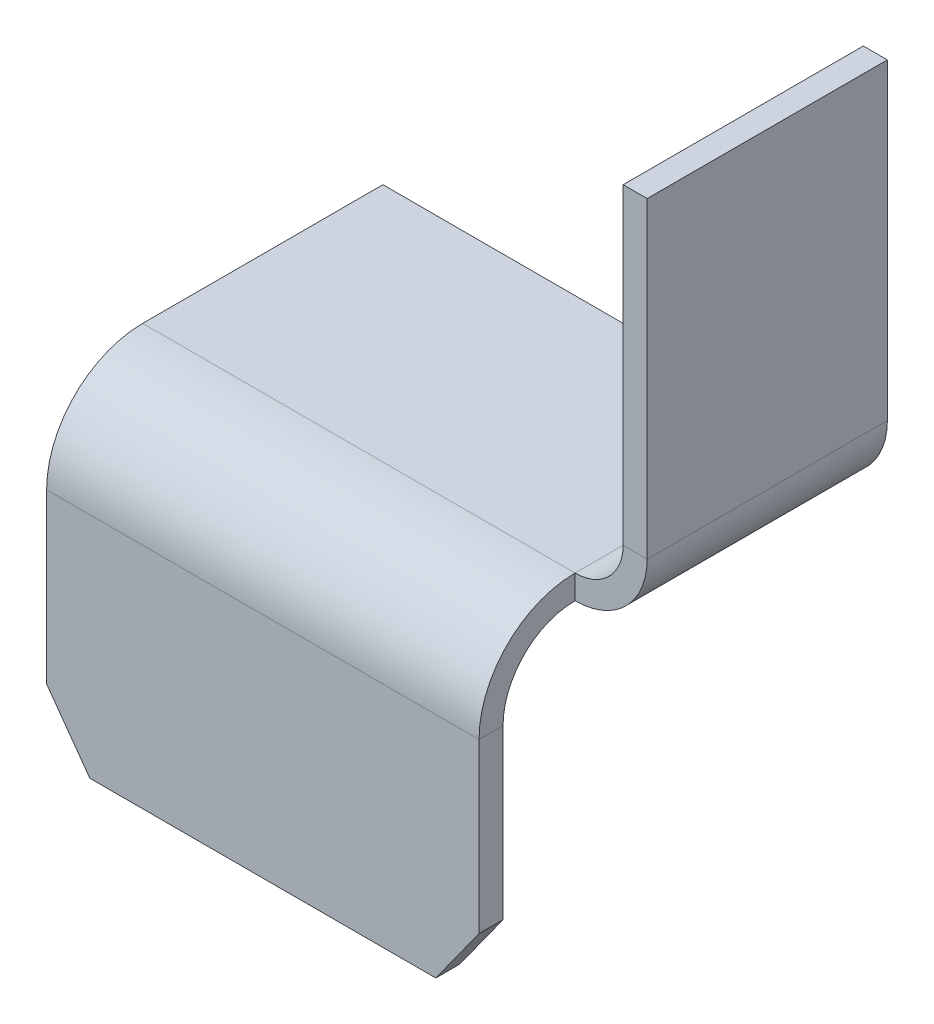
ISO-10303-21;
HEADER;
FILE_DESCRIPTION(('STEP AP214'),'2;1');
FILE_NAME('part.step','',(''),(''),'','','');
FILE_SCHEMA(('AUTOMOTIVE_DESIGN { 1 0 10303 214 1 1 1 1 }'));
ENDSEC;
DATA;
#1=APPLICATION_CONTEXT('core data for automotive mechanical design processes');
#2=APPLICATION_PROTOCOL_DEFINITION('international standard','automotive_design',2000,#1);
#3=PRODUCT_CONTEXT('',#1,'mechanical');
#4=PRODUCT('Part','Part','',(#3));
#5=PRODUCT_RELATED_PRODUCT_CATEGORY('part','',(#4));
#6=PRODUCT_DEFINITION_FORMATION('','',#4);
#7=PRODUCT_DEFINITION_CONTEXT('part definition',#1,'design');
#8=PRODUCT_DEFINITION('design','',#6,#7);
#9=PRODUCT_DEFINITION_SHAPE('','',#8);
#10=(LENGTH_UNIT() NAMED_UNIT(*) SI_UNIT(.MILLI.,.METRE.));
#11=(NAMED_UNIT(*) PLANE_ANGLE_UNIT() SI_UNIT($,.RADIAN.));
#12=(NAMED_UNIT(*) SI_UNIT($,.STERADIAN.) SOLID_ANGLE_UNIT());
#13=UNCERTAINTY_MEASURE_WITH_UNIT(LENGTH_MEASURE(1.E-05),#10,'distance_accuracy_value','');
#14=(GEOMETRIC_REPRESENTATION_CONTEXT(3) GLOBAL_UNCERTAINTY_ASSIGNED_CONTEXT((#13)) GLOBAL_UNIT_ASSIGNED_CONTEXT((#10,
#11,#12)) REPRESENTATION_CONTEXT('',''));
#15=CARTESIAN_POINT('',(0.,0.,0.));
#16=DIRECTION('',(0.,0.,1.));
#17=DIRECTION('',(1.,0.,0.));
#18=AXIS2_PLACEMENT_3D('',#15,#16,#17);
#19=CARTESIAN_POINT('',(20.,2.,10.));
#20=DIRECTION('',(0.,0.,1.));
#21=DIRECTION('',(1.,0.,0.));
#22=AXIS2_PLACEMENT_3D('',#19,#20,#21);
#23=PLANE('',#22);
#24=DIRECTION('',(1.,0.,0.));
#25=VECTOR('',#24,1.);
#26=CARTESIAN_POINT('',(20.,2.,10.));
#27=LINE('',#26,#25);
#28=CARTESIAN_POINT('',(20.,2.,10.));
#29=VERTEX_POINT('',#28);
#30=CARTESIAN_POINT('',(21.,2.,10.));
#31=VERTEX_POINT('',#30);
#32=EDGE_CURVE('E13',#29,#31,#27,.T.);
#33=ORIENTED_EDGE('',*,*,#32,.F.);
#34=CARTESIAN_POINT('',(18.,2.,10.));
#35=DIRECTION('',(0.,0.,-1.));
#36=DIRECTION('',(-1.,0.,0.));
#37=AXIS2_PLACEMENT_3D('',#34,#35,#36);
#38=CIRCLE('',#37,2.);
#39=CARTESIAN_POINT('',(18.,0.,10.));
#40=VERTEX_POINT('',#39);
#41=EDGE_CURVE('E138',#40,#29,#38,.F.);
#42=ORIENTED_EDGE('',*,*,#41,.F.);
#43=DIRECTION('',(0.,1.,0.));
#44=VECTOR('',#43,1.);
#45=CARTESIAN_POINT('',(18.,-1.,10.));
#46=LINE('',#45,#44);
#47=CARTESIAN_POINT('',(18.,-0.999999999999999,10.));
#48=VERTEX_POINT('',#47);
#49=EDGE_CURVE('E78',#48,#40,#46,.T.);
#50=ORIENTED_EDGE('',*,*,#49,.F.);
#51=CARTESIAN_POINT('',(18.,2.,10.));
#52=DIRECTION('',(0.,0.,1.));
#53=DIRECTION('',(1.,0.,0.));
#54=AXIS2_PLACEMENT_3D('',#51,#52,#53);
#55=CIRCLE('',#54,3.);
#56=EDGE_CURVE('E141',#48,#31,#55,.T.);
#57=ORIENTED_EDGE('',*,*,#56,.T.);
#58=EDGE_LOOP('',(#33,#42,#50,#57));
#59=FACE_BOUND('',#58,.T.);
#60=ADVANCED_FACE('F72',(#59),#23,.T.);
#61=CARTESIAN_POINT('',(18.,-1.,10.));
#62=DIRECTION('',(0.,0.,1.));
#63=DIRECTION('',(1.,0.,0.));
#64=AXIS2_PLACEMENT_3D('',#61,#62,#63);
#65=PLANE('',#64);
#66=DIRECTION('',(0.,1.,0.));
#67=VECTOR('',#66,1.);
#68=CARTESIAN_POINT('',(20.,0.,10.));
#69=LINE('',#68,#67);
#70=CARTESIAN_POINT('',(20.,15.,10.));
#71=VERTEX_POINT('',#70);
#72=EDGE_CURVE('E151',#29,#71,#69,.T.);
#73=ORIENTED_EDGE('',*,*,#72,.F.);
#74=ORIENTED_EDGE('',*,*,#32,.T.);
#75=DIRECTION('',(0.,1.,0.));
#76=VECTOR('',#75,1.);
#77=CARTESIAN_POINT('',(21.,0.,10.));
#78=LINE('',#77,#76);
#79=CARTESIAN_POINT('',(21.,15.,10.));
#80=VERTEX_POINT('',#79);
#81=EDGE_CURVE('E126',#31,#80,#78,.T.);
#82=ORIENTED_EDGE('',*,*,#81,.T.);
#83=DIRECTION('',(1.,0.,0.));
#84=VECTOR('',#83,1.);
#85=CARTESIAN_POINT('',(20.,15.,10.));
#86=LINE('',#85,#84);
#87=EDGE_CURVE('E161',#71,#80,#86,.T.);
#88=ORIENTED_EDGE('',*,*,#87,.F.);
#89=EDGE_LOOP('',(#73,#74,#82,#88));
#90=FACE_BOUND('',#89,.T.);
#91=ADVANCED_FACE('F157',(#90),#65,.T.);
#92=CARTESIAN_POINT('',(18.,0.,0.));
#93=DIRECTION('',(0.,0.,-1.));
#94=DIRECTION('',(-1.,0.,0.));
#95=AXIS2_PLACEMENT_3D('',#92,#93,#94);
#96=PLANE('',#95);
#97=DIRECTION('',(0.,-1.,0.));
#98=VECTOR('',#97,1.);
#99=CARTESIAN_POINT('',(18.,0.,0.));
#100=LINE('',#99,#98);
#101=CARTESIAN_POINT('',(18.,0.,0.));
#102=VERTEX_POINT('',#101);
#103=CARTESIAN_POINT('',(18.,-1.,0.));
#104=VERTEX_POINT('',#103);
#105=EDGE_CURVE('E113',#102,#104,#100,.T.);
#106=ORIENTED_EDGE('',*,*,#105,.F.);
#107=CARTESIAN_POINT('',(18.,2.,0.));
#108=DIRECTION('',(0.,0.,-1.));
#109=DIRECTION('',(-1.,0.,0.));
#110=AXIS2_PLACEMENT_3D('',#107,#108,#109);
#111=CIRCLE('',#110,2.);
#112=CARTESIAN_POINT('',(20.,2.,0.));
#113=VERTEX_POINT('',#112);
#114=EDGE_CURVE('E187',#102,#113,#111,.F.);
#115=ORIENTED_EDGE('',*,*,#114,.T.);
#116=DIRECTION('',(-1.,0.,0.));
#117=VECTOR('',#116,1.);
#118=CARTESIAN_POINT('',(21.,2.,0.));
#119=LINE('',#118,#117);
#120=CARTESIAN_POINT('',(21.,2.,0.));
#121=VERTEX_POINT('',#120);
#122=EDGE_CURVE('E124',#121,#113,#119,.T.);
#123=ORIENTED_EDGE('',*,*,#122,.F.);
#124=CARTESIAN_POINT('',(18.,2.,0.));
#125=DIRECTION('',(0.,0.,1.));
#126=DIRECTION('',(1.,0.,0.));
#127=AXIS2_PLACEMENT_3D('',#124,#125,#126);
#128=CIRCLE('',#127,3.);
#129=EDGE_CURVE('E198',#104,#121,#128,.T.);
#130=ORIENTED_EDGE('',*,*,#129,.F.);
#131=EDGE_LOOP('',(#106,#115,#123,#130));
#132=FACE_BOUND('',#131,.T.);
#133=ADVANCED_FACE('F365',(#132),#96,.T.);
#134=CARTESIAN_POINT('',(21.,2.,0.));
#135=DIRECTION('',(0.,0.,-1.));
#136=DIRECTION('',(-1.,0.,0.));
#137=AXIS2_PLACEMENT_3D('',#134,#135,#136);
#138=PLANE('',#137);
#139=DIRECTION('',(1.,0.,0.));
#140=VECTOR('',#139,1.);
#141=CARTESIAN_POINT('',(0.,0.,0.));
#142=LINE('',#141,#140);
#143=CARTESIAN_POINT('',(0.,0.,0.));
#144=VERTEX_POINT('',#143);
#145=EDGE_CURVE('E188',#144,#102,#142,.T.);
#146=ORIENTED_EDGE('',*,*,#145,.T.);
#147=ORIENTED_EDGE('',*,*,#105,.T.);
#148=DIRECTION('',(1.,0.,0.));
#149=VECTOR('',#148,1.);
#150=CARTESIAN_POINT('',(0.,-1.,0.));
#151=LINE('',#150,#149);
#152=CARTESIAN_POINT('',(0.,-1.,0.));
#153=VERTEX_POINT('',#152);
#154=EDGE_CURVE('E191',#153,#104,#151,.T.);
#155=ORIENTED_EDGE('',*,*,#154,.F.);
#156=DIRECTION('',(0.,1.,0.));
#157=VECTOR('',#156,1.);
#158=CARTESIAN_POINT('',(0.,-1.,0.));
#159=LINE('',#158,#157);
#160=EDGE_CURVE('E192',#153,#144,#159,.T.);
#161=ORIENTED_EDGE('',*,*,#160,.T.);
#162=EDGE_LOOP('',(#146,#147,#155,#161));
#163=FACE_BOUND('',#162,.T.);
#164=ADVANCED_FACE('F362',(#163),#138,.T.);
#165=CARTESIAN_POINT('',(21.,0.,10.));
#166=DIRECTION('',(-1.,0.,0.));
#167=DIRECTION('',(0.,0.,1.));
#168=AXIS2_PLACEMENT_3D('',#165,#166,#167);
#169=PLANE('',#168);
#170=DIRECTION('',(0.,1.,0.));
#171=VECTOR('',#170,1.);
#172=CARTESIAN_POINT('',(21.,0.,0.));
#173=LINE('',#172,#171);
#174=CARTESIAN_POINT('',(21.,15.,0.));
#175=VERTEX_POINT('',#174);
#176=EDGE_CURVE('E176',#121,#175,#173,.T.);
#177=ORIENTED_EDGE('',*,*,#176,.T.);
#178=DIRECTION('',(0.,0.,-1.));
#179=VECTOR('',#178,1.);
#180=CARTESIAN_POINT('',(21.,15.,10.));
#181=LINE('',#180,#179);
#182=EDGE_CURVE('E207',#80,#175,#181,.T.);
#183=ORIENTED_EDGE('',*,*,#182,.F.);
#184=ORIENTED_EDGE('',*,*,#81,.F.);
#185=DIRECTION('',(0.,0.,-1.));
#186=VECTOR('',#185,1.);
#187=CARTESIAN_POINT('',(21.,2.,10.));
#188=LINE('',#187,#186);
#189=EDGE_CURVE('E180',#31,#121,#188,.T.);
#190=ORIENTED_EDGE('',*,*,#189,.T.);
#191=EDGE_LOOP('',(#177,#183,#184,#190));
#192=FACE_BOUND('',#191,.T.);
#193=ADVANCED_FACE('F235',(#192),#169,.F.);
#194=CARTESIAN_POINT('',(20.,15.,10.));
#195=DIRECTION('',(0.,1.,0.));
#196=DIRECTION('',(0.,0.,1.));
#197=AXIS2_PLACEMENT_3D('',#194,#195,#196);
#198=PLANE('',#197);
#199=DIRECTION('',(1.,0.,0.));
#200=VECTOR('',#199,1.);
#201=CARTESIAN_POINT('',(20.,15.,0.));
#202=LINE('',#201,#200);
#203=CARTESIAN_POINT('',(20.,15.,0.));
#204=VERTEX_POINT('',#203);
#205=EDGE_CURVE('E185',#204,#175,#202,.T.);
#206=ORIENTED_EDGE('',*,*,#205,.F.);
#207=DIRECTION('',(0.,0.,-1.));
#208=VECTOR('',#207,1.);
#209=CARTESIAN_POINT('',(20.,15.,10.));
#210=LINE('',#209,#208);
#211=EDGE_CURVE('E156',#71,#204,#210,.T.);
#212=ORIENTED_EDGE('',*,*,#211,.F.);
#213=ORIENTED_EDGE('',*,*,#87,.T.);
#214=ORIENTED_EDGE('',*,*,#182,.T.);
#215=EDGE_LOOP('',(#206,#212,#213,#214));
#216=FACE_BOUND('',#215,.T.);
#217=ADVANCED_FACE('F367',(#216),#198,.T.);
#218=CARTESIAN_POINT('',(20.,0.,10.));
#219=DIRECTION('',(-1.,0.,0.));
#220=DIRECTION('',(0.,0.,1.));
#221=AXIS2_PLACEMENT_3D('',#218,#219,#220);
#222=PLANE('',#221);
#223=DIRECTION('',(0.,1.,0.));
#224=VECTOR('',#223,1.);
#225=CARTESIAN_POINT('',(20.,0.,0.));
#226=LINE('',#225,#224);
#227=EDGE_CURVE('E153',#113,#204,#226,.T.);
#228=ORIENTED_EDGE('',*,*,#227,.F.);
#229=DIRECTION('',(0.,0.,-1.));
#230=VECTOR('',#229,1.);
#231=CARTESIAN_POINT('',(20.,2.,10.));
#232=LINE('',#231,#230);
#233=EDGE_CURVE('E149',#29,#113,#232,.T.);
#234=ORIENTED_EDGE('',*,*,#233,.F.);
#235=ORIENTED_EDGE('',*,*,#72,.T.);
#236=ORIENTED_EDGE('',*,*,#211,.T.);
#237=EDGE_LOOP('',(#228,#234,#235,#236));
#238=FACE_BOUND('',#237,.T.);
#239=ADVANCED_FACE('F147',(#238),#222,.T.);
#240=CARTESIAN_POINT('',(18.,2.,10.));
#241=DIRECTION('',(0.,0.,-1.));
#242=DIRECTION('',(-1.,0.,0.));
#243=AXIS2_PLACEMENT_3D('',#240,#241,#242);
#244=CYLINDRICAL_SURFACE('',#243,2.);
#245=ORIENTED_EDGE('',*,*,#114,.F.);
#246=DIRECTION('',(0.,0.,-1.));
#247=VECTOR('',#246,1.);
#248=CARTESIAN_POINT('',(18.,0.,10.));
#249=LINE('',#248,#247);
#250=EDGE_CURVE('E160',#40,#102,#249,.T.);
#251=ORIENTED_EDGE('',*,*,#250,.F.);
#252=ORIENTED_EDGE('',*,*,#41,.T.);
#253=ORIENTED_EDGE('',*,*,#233,.T.);
#254=EDGE_LOOP('',(#245,#251,#252,#253));
#255=FACE_BOUND('',#254,.T.);
#256=ADVANCED_FACE('F163',(#255),#244,.F.);
#257=CARTESIAN_POINT('',(0.,0.,10.));
#258=DIRECTION('',(0.,1.,0.));
#259=DIRECTION('',(0.,0.,1.));
#260=AXIS2_PLACEMENT_3D('',#257,#258,#259);
#261=PLANE('',#260);
#262=ORIENTED_EDGE('',*,*,#145,.F.);
#263=DIRECTION('',(0.,0.,-1.));
#264=VECTOR('',#263,1.);
#265=CARTESIAN_POINT('',(0.,0.,10.));
#266=LINE('',#265,#264);
#267=CARTESIAN_POINT('',(0.,0.,10.));
#268=VERTEX_POINT('',#267);
#269=EDGE_CURVE('E202',#268,#144,#266,.T.);
#270=ORIENTED_EDGE('',*,*,#269,.F.);
#271=DIRECTION('',(1.,0.,0.));
#272=VECTOR('',#271,1.);
#273=CARTESIAN_POINT('',(0.,0.,10.));
#274=LINE('',#273,#272);
#275=EDGE_CURVE('E167',#268,#40,#274,.T.);
#276=ORIENTED_EDGE('',*,*,#275,.T.);
#277=ORIENTED_EDGE('',*,*,#250,.T.);
#278=EDGE_LOOP('',(#262,#270,#276,#277));
#279=FACE_BOUND('',#278,.T.);
#280=ADVANCED_FACE('F359',(#279),#261,.T.);
#281=CARTESIAN_POINT('',(0.,-1.,10.));
#282=DIRECTION('',(-1.,0.,0.));
#283=DIRECTION('',(0.,0.,1.));
#284=AXIS2_PLACEMENT_3D('',#281,#282,#283);
#285=PLANE('',#284);
#286=ORIENTED_EDGE('',*,*,#160,.F.);
#287=DIRECTION('',(0.,0.,-1.));
#288=VECTOR('',#287,1.);
#289=CARTESIAN_POINT('',(0.,-1.,10.));
#290=LINE('',#289,#288);
#291=CARTESIAN_POINT('',(0.,-0.999999999999999,10.));
#292=VERTEX_POINT('',#291);
#293=EDGE_CURVE('E201',#292,#153,#290,.T.);
#294=ORIENTED_EDGE('',*,*,#293,.F.);
#295=DIRECTION('',(0.,1.,0.));
#296=VECTOR('',#295,1.);
#297=CARTESIAN_POINT('',(0.,-1.,10.));
#298=LINE('',#297,#296);
#299=EDGE_CURVE('E169',#292,#268,#298,.T.);
#300=ORIENTED_EDGE('',*,*,#299,.T.);
#301=ORIENTED_EDGE('',*,*,#269,.T.);
#302=EDGE_LOOP('',(#286,#294,#300,#301));
#303=FACE_BOUND('',#302,.T.);
#304=ADVANCED_FACE('F363',(#303),#285,.T.);
#305=CARTESIAN_POINT('',(0.,-1.,10.));
#306=DIRECTION('',(0.,1.,0.));
#307=DIRECTION('',(0.,0.,1.));
#308=AXIS2_PLACEMENT_3D('',#305,#306,#307);
#309=PLANE('',#308);
#310=ORIENTED_EDGE('',*,*,#154,.T.);
#311=DIRECTION('',(0.,0.,-1.));
#312=VECTOR('',#311,1.);
#313=CARTESIAN_POINT('',(18.,-1.,10.));
#314=LINE('',#313,#312);
#315=EDGE_CURVE('E199',#48,#104,#314,.T.);
#316=ORIENTED_EDGE('',*,*,#315,.F.);
#317=DIRECTION('',(1.,0.,0.));
#318=VECTOR('',#317,1.);
#319=CARTESIAN_POINT('',(0.,-1.,10.));
#320=LINE('',#319,#318);
#321=EDGE_CURVE('E173',#292,#48,#320,.T.);
#322=ORIENTED_EDGE('',*,*,#321,.F.);
#323=ORIENTED_EDGE('',*,*,#293,.T.);
#324=EDGE_LOOP('',(#310,#316,#322,#323));
#325=FACE_BOUND('',#324,.T.);
#326=ADVANCED_FACE('F229',(#325),#309,.F.);
#327=CARTESIAN_POINT('',(18.,2.,10.));
#328=DIRECTION('',(0.,0.,-1.));
#329=DIRECTION('',(-1.,0.,0.));
#330=AXIS2_PLACEMENT_3D('',#327,#328,#329);
#331=CYLINDRICAL_SURFACE('',#330,3.);
#332=ORIENTED_EDGE('',*,*,#129,.T.);
#333=ORIENTED_EDGE('',*,*,#189,.F.);
#334=ORIENTED_EDGE('',*,*,#56,.F.);
#335=ORIENTED_EDGE('',*,*,#315,.T.);
#336=EDGE_LOOP('',(#332,#333,#334,#335));
#337=FACE_BOUND('',#336,.T.);
#338=ADVANCED_FACE('F230',(#337),#331,.T.);
#339=CARTESIAN_POINT('',(18.,2.,0.));
#340=DIRECTION('',(0.,0.,-1.));
#341=DIRECTION('',(-1.,0.,0.));
#342=AXIS2_PLACEMENT_3D('',#339,#340,#341);
#343=PLANE('',#342);
#344=ORIENTED_EDGE('',*,*,#176,.F.);
#345=ORIENTED_EDGE('',*,*,#122,.T.);
#346=ORIENTED_EDGE('',*,*,#227,.T.);
#347=ORIENTED_EDGE('',*,*,#205,.T.);
#348=EDGE_LOOP('',(#344,#345,#346,#347));
#349=FACE_BOUND('',#348,.T.);
#350=ADVANCED_FACE('F464',(#349),#343,.T.);
#351=CARTESIAN_POINT('',(18.,-4.,10.));
#352=DIRECTION('',(1.,0.,0.));
#353=DIRECTION('',(0.,0.,-1.));
#354=AXIS2_PLACEMENT_3D('',#351,#352,#353);
#355=PLANE('',#354);
#356=DIRECTION('',(0.,0.,-1.));
#357=VECTOR('',#356,1.);
#358=CARTESIAN_POINT('',(18.,-4.,14.));
#359=LINE('',#358,#357);
#360=CARTESIAN_POINT('',(18.,-4.,13.));
#361=VERTEX_POINT('',#360);
#362=CARTESIAN_POINT('',(18.,-4.,14.));
#363=VERTEX_POINT('',#362);
#364=EDGE_CURVE('E245',#361,#363,#359,.F.);
#365=ORIENTED_EDGE('',*,*,#364,.F.);
#366=CARTESIAN_POINT('',(18.,-4.,10.));
#367=DIRECTION('',(-1.,0.,0.));
#368=DIRECTION('',(0.,0.,1.));
#369=AXIS2_PLACEMENT_3D('',#366,#367,#368);
#370=CIRCLE('',#369,3.);
#371=EDGE_CURVE('E225',#48,#361,#370,.F.);
#372=ORIENTED_EDGE('',*,*,#371,.F.);
#373=ORIENTED_EDGE('',*,*,#49,.T.);
#374=CARTESIAN_POINT('',(18.,-4.,10.));
#375=DIRECTION('',(-1.,0.,0.));
#376=DIRECTION('',(0.,0.,1.));
#377=AXIS2_PLACEMENT_3D('',#374,#375,#376);
#378=CIRCLE('',#377,4.);
#379=EDGE_CURVE('E181',#40,#363,#378,.F.);
#380=ORIENTED_EDGE('',*,*,#379,.T.);
#381=EDGE_LOOP('',(#365,#372,#373,#380));
#382=FACE_BOUND('',#381,.T.);
#383=ADVANCED_FACE('F220',(#382),#355,.T.);
#384=CARTESIAN_POINT('',(0.,-4.,10.));
#385=DIRECTION('',(1.,0.,0.));
#386=DIRECTION('',(0.,0.,-1.));
#387=AXIS2_PLACEMENT_3D('',#384,#385,#386);
#388=PLANE('',#387);
#389=CARTESIAN_POINT('',(0.,-4.,10.));
#390=DIRECTION('',(-1.,0.,0.));
#391=DIRECTION('',(0.,0.,1.));
#392=AXIS2_PLACEMENT_3D('',#389,#390,#391);
#393=CIRCLE('',#392,3.);
#394=CARTESIAN_POINT('',(0.,-4.,13.));
#395=VERTEX_POINT('',#394);
#396=EDGE_CURVE('E237',#395,#292,#393,.T.);
#397=ORIENTED_EDGE('',*,*,#396,.F.);
#398=DIRECTION('',(0.,0.,-1.));
#399=VECTOR('',#398,1.);
#400=CARTESIAN_POINT('',(0.,-4.,13.));
#401=LINE('',#400,#399);
#402=CARTESIAN_POINT('',(0.,-4.,14.));
#403=VERTEX_POINT('',#402);
#404=EDGE_CURVE('E248',#395,#403,#401,.F.);
#405=ORIENTED_EDGE('',*,*,#404,.T.);
#406=CARTESIAN_POINT('',(0.,-4.,10.));
#407=DIRECTION('',(-1.,0.,0.));
#408=DIRECTION('',(0.,0.,1.));
#409=AXIS2_PLACEMENT_3D('',#406,#407,#408);
#410=CIRCLE('',#409,4.);
#411=EDGE_CURVE('E241',#403,#268,#410,.T.);
#412=ORIENTED_EDGE('',*,*,#411,.T.);
#413=ORIENTED_EDGE('',*,*,#299,.F.);
#414=EDGE_LOOP('',(#397,#405,#412,#413));
#415=FACE_BOUND('',#414,.T.);
#416=ADVANCED_FACE('F355',(#415),#388,.F.);
#417=CARTESIAN_POINT('',(0.,-4.,10.));
#418=DIRECTION('',(-1.,0.,0.));
#419=DIRECTION('',(0.,0.,1.));
#420=AXIS2_PLACEMENT_3D('',#417,#418,#419);
#421=CYLINDRICAL_SURFACE('',#420,4.);
#422=ORIENTED_EDGE('',*,*,#275,.F.);
#423=ORIENTED_EDGE('',*,*,#411,.F.);
#424=DIRECTION('',(-1.,0.,0.));
#425=VECTOR('',#424,1.);
#426=CARTESIAN_POINT('',(0.,-4.,14.));
#427=LINE('',#426,#425);
#428=EDGE_CURVE('E251',#363,#403,#427,.T.);
#429=ORIENTED_EDGE('',*,*,#428,.F.);
#430=ORIENTED_EDGE('',*,*,#379,.F.);
#431=EDGE_LOOP('',(#422,#423,#429,#430));
#432=FACE_BOUND('',#431,.T.);
#433=ADVANCED_FACE('F348',(#432),#421,.T.);
#434=CARTESIAN_POINT('',(0.,-4.,10.));
#435=DIRECTION('',(-1.,0.,0.));
#436=DIRECTION('',(0.,0.,1.));
#437=AXIS2_PLACEMENT_3D('',#434,#435,#436);
#438=CYLINDRICAL_SURFACE('',#437,3.);
#439=ORIENTED_EDGE('',*,*,#321,.T.);
#440=ORIENTED_EDGE('',*,*,#371,.T.);
#441=DIRECTION('',(1.,0.,0.));
#442=VECTOR('',#441,1.);
#443=CARTESIAN_POINT('',(18.,-4.,13.));
#444=LINE('',#443,#442);
#445=EDGE_CURVE('E249',#361,#395,#444,.F.);
#446=ORIENTED_EDGE('',*,*,#445,.T.);
#447=ORIENTED_EDGE('',*,*,#396,.T.);
#448=EDGE_LOOP('',(#439,#440,#446,#447));
#449=FACE_BOUND('',#448,.T.);
#450=ADVANCED_FACE('F498',(#449),#438,.F.);
#451=CARTESIAN_POINT('',(0.,-1.,14.));
#452=DIRECTION('',(1.,0.,0.));
#453=DIRECTION('',(0.,0.,-1.));
#454=AXIS2_PLACEMENT_3D('',#451,#452,#453);
#455=PLANE('',#454);
#456=ORIENTED_EDGE('',*,*,#404,.F.);
#457=DIRECTION('',(0.,-1.,0.));
#458=VECTOR('',#457,1.);
#459=CARTESIAN_POINT('',(0.,-1.,13.));
#460=LINE('',#459,#458);
#461=CARTESIAN_POINT('',(0.,-11.,13.));
#462=VERTEX_POINT('',#461);
#463=EDGE_CURVE('E258',#395,#462,#460,.T.);
#464=ORIENTED_EDGE('',*,*,#463,.T.);
#465=DIRECTION('',(0.,0.,-1.));
#466=VECTOR('',#465,1.);
#467=CARTESIAN_POINT('',(0.,-11.,14.));
#468=LINE('',#467,#466);
#469=CARTESIAN_POINT('',(0.,-11.,14.));
#470=VERTEX_POINT('',#469);
#471=EDGE_CURVE('E239',#470,#462,#468,.T.);
#472=ORIENTED_EDGE('',*,*,#471,.F.);
#473=DIRECTION('',(0.,1.,0.));
#474=VECTOR('',#473,1.);
#475=CARTESIAN_POINT('',(0.,0.,14.));
#476=LINE('',#475,#474);
#477=EDGE_CURVE('E271',#403,#470,#476,.F.);
#478=ORIENTED_EDGE('',*,*,#477,.F.);
#479=EDGE_LOOP('',(#456,#464,#472,#478));
#480=FACE_BOUND('',#479,.T.);
#481=ADVANCED_FACE('F310',(#480),#455,.F.);
#482=CARTESIAN_POINT('',(18.,-1.,14.));
#483=DIRECTION('',(-1.,0.,0.));
#484=DIRECTION('',(0.,0.,1.));
#485=AXIS2_PLACEMENT_3D('',#482,#483,#484);
#486=PLANE('',#485);
#487=ORIENTED_EDGE('',*,*,#364,.T.);
#488=DIRECTION('',(0.,-1.,0.));
#489=VECTOR('',#488,1.);
#490=CARTESIAN_POINT('',(18.,0.,14.));
#491=LINE('',#490,#489);
#492=CARTESIAN_POINT('',(18.,-11.,14.));
#493=VERTEX_POINT('',#492);
#494=EDGE_CURVE('E284',#493,#363,#491,.F.);
#495=ORIENTED_EDGE('',*,*,#494,.F.);
#496=DIRECTION('',(0.,0.,-1.));
#497=VECTOR('',#496,1.);
#498=CARTESIAN_POINT('',(18.,-11.,14.));
#499=LINE('',#498,#497);
#500=CARTESIAN_POINT('',(18.,-11.,13.));
#501=VERTEX_POINT('',#500);
#502=EDGE_CURVE('E287',#493,#501,#499,.T.);
#503=ORIENTED_EDGE('',*,*,#502,.T.);
#504=DIRECTION('',(0.,1.,0.));
#505=VECTOR('',#504,1.);
#506=CARTESIAN_POINT('',(18.,-1.,13.));
#507=LINE('',#506,#505);
#508=EDGE_CURVE('E268',#501,#361,#507,.T.);
#509=ORIENTED_EDGE('',*,*,#508,.T.);
#510=EDGE_LOOP('',(#487,#495,#503,#509));
#511=FACE_BOUND('',#510,.T.);
#512=ADVANCED_FACE('F349',(#511),#486,.F.);
#513=CARTESIAN_POINT('',(0.,0.,14.));
#514=DIRECTION('',(0.,0.,1.));
#515=DIRECTION('',(1.,0.,0.));
#516=AXIS2_PLACEMENT_3D('',#513,#514,#515);
#517=PLANE('',#516);
#518=ORIENTED_EDGE('',*,*,#494,.T.);
#519=ORIENTED_EDGE('',*,*,#428,.T.);
#520=ORIENTED_EDGE('',*,*,#477,.T.);
#521=DIRECTION('',(-0.584304725845076,0.811534341451495,0.));
#522=VECTOR('',#521,1.);
#523=CARTESIAN_POINT('',(-5.21601685985248,-3.75553213909378,14.));
#524=LINE('',#523,#522);
#525=CARTESIAN_POINT('',(1.8,-13.5,14.));
#526=VERTEX_POINT('',#525);
#527=EDGE_CURVE('E273',#470,#526,#524,.F.);
#528=ORIENTED_EDGE('',*,*,#527,.T.);
#529=DIRECTION('',(-1.,0.,0.));
#530=VECTOR('',#529,1.);
#531=CARTESIAN_POINT('',(0.,-13.5,14.));
#532=LINE('',#531,#530);
#533=CARTESIAN_POINT('',(16.2,-13.5,14.));
#534=VERTEX_POINT('',#533);
#535=EDGE_CURVE('E280',#526,#534,#532,.F.);
#536=ORIENTED_EDGE('',*,*,#535,.T.);
#537=DIRECTION('',(-0.584304725845076,-0.811534341451495,0.));
#538=VECTOR('',#537,1.);
#539=CARTESIAN_POINT('',(17.0706006322445,-12.290832455216,14.));
#540=LINE('',#539,#538);
#541=EDGE_CURVE('E278',#534,#493,#540,.F.);
#542=ORIENTED_EDGE('',*,*,#541,.T.);
#543=EDGE_LOOP('',(#518,#519,#520,#528,#536,#542));
#544=FACE_BOUND('',#543,.T.);
#545=ADVANCED_FACE('F337',(#544),#517,.T.);
#546=CARTESIAN_POINT('',(0.,0.,13.));
#547=DIRECTION('',(0.,0.,1.));
#548=DIRECTION('',(1.,0.,0.));
#549=AXIS2_PLACEMENT_3D('',#546,#547,#548);
#550=PLANE('',#549);
#551=ORIENTED_EDGE('',*,*,#445,.F.);
#552=ORIENTED_EDGE('',*,*,#508,.F.);
#553=DIRECTION('',(0.584304725845076,0.811534341451495,0.));
#554=VECTOR('',#553,1.);
#555=CARTESIAN_POINT('',(16.2,-13.5,13.));
#556=LINE('',#555,#554);
#557=CARTESIAN_POINT('',(16.2,-13.5,13.));
#558=VERTEX_POINT('',#557);
#559=EDGE_CURVE('E264',#558,#501,#556,.T.);
#560=ORIENTED_EDGE('',*,*,#559,.F.);
#561=DIRECTION('',(1.,0.,0.));
#562=VECTOR('',#561,1.);
#563=CARTESIAN_POINT('',(1.8,-13.5,13.));
#564=LINE('',#563,#562);
#565=CARTESIAN_POINT('',(1.8,-13.5,13.));
#566=VERTEX_POINT('',#565);
#567=EDGE_CURVE('E265',#566,#558,#564,.T.);
#568=ORIENTED_EDGE('',*,*,#567,.F.);
#569=DIRECTION('',(0.584304725845076,-0.811534341451495,0.));
#570=VECTOR('',#569,1.);
#571=CARTESIAN_POINT('',(0.,-11.,13.));
#572=LINE('',#571,#570);
#573=EDGE_CURVE('E259',#462,#566,#572,.T.);
#574=ORIENTED_EDGE('',*,*,#573,.F.);
#575=ORIENTED_EDGE('',*,*,#463,.F.);
#576=EDGE_LOOP('',(#551,#552,#560,#568,#574,#575));
#577=FACE_BOUND('',#576,.T.);
#578=ADVANCED_FACE('F538',(#577),#550,.F.);
#579=CARTESIAN_POINT('',(0.,-11.,14.));
#580=DIRECTION('',(0.811534341451495,0.584304725845076,0.));
#581=DIRECTION('',(-0.584304725845076,0.811534341451495,0.));
#582=AXIS2_PLACEMENT_3D('',#579,#580,#581);
#583=PLANE('',#582);
#584=ORIENTED_EDGE('',*,*,#573,.T.);
#585=DIRECTION('',(0.,0.,-1.));
#586=VECTOR('',#585,1.);
#587=CARTESIAN_POINT('',(1.8,-13.5,14.));
#588=LINE('',#587,#586);
#589=EDGE_CURVE('E295',#526,#566,#588,.T.);
#590=ORIENTED_EDGE('',*,*,#589,.F.);
#591=ORIENTED_EDGE('',*,*,#527,.F.);
#592=ORIENTED_EDGE('',*,*,#471,.T.);
#593=EDGE_LOOP('',(#584,#590,#591,#592));
#594=FACE_BOUND('',#593,.T.);
#595=ADVANCED_FACE('F300',(#594),#583,.F.);
#596=CARTESIAN_POINT('',(1.8,-13.5,14.));
#597=DIRECTION('',(0.,1.,0.));
#598=DIRECTION('',(0.,0.,1.));
#599=AXIS2_PLACEMENT_3D('',#596,#597,#598);
#600=PLANE('',#599);
#601=ORIENTED_EDGE('',*,*,#567,.T.);
#602=DIRECTION('',(0.,0.,-1.));
#603=VECTOR('',#602,1.);
#604=CARTESIAN_POINT('',(16.2,-13.5,14.));
#605=LINE('',#604,#603);
#606=EDGE_CURVE('E286',#534,#558,#605,.T.);
#607=ORIENTED_EDGE('',*,*,#606,.F.);
#608=ORIENTED_EDGE('',*,*,#535,.F.);
#609=ORIENTED_EDGE('',*,*,#589,.T.);
#610=EDGE_LOOP('',(#601,#607,#608,#609));
#611=FACE_BOUND('',#610,.T.);
#612=ADVANCED_FACE('F342',(#611),#600,.F.);
#613=CARTESIAN_POINT('',(16.2,-13.5,14.));
#614=DIRECTION('',(-0.811534341451495,0.584304725845076,0.));
#615=DIRECTION('',(-0.584304725845076,-0.811534341451495,0.));
#616=AXIS2_PLACEMENT_3D('',#613,#614,#615);
#617=PLANE('',#616);
#618=ORIENTED_EDGE('',*,*,#559,.T.);
#619=ORIENTED_EDGE('',*,*,#502,.F.);
#620=ORIENTED_EDGE('',*,*,#541,.F.);
#621=ORIENTED_EDGE('',*,*,#606,.T.);
#622=EDGE_LOOP('',(#618,#619,#620,#621));
#623=FACE_BOUND('',#622,.T.);
#624=ADVANCED_FACE('F343',(#623),#617,.F.);
#625=CLOSED_SHELL('',(#60,#91,#133,#164,#193,#217,#239,#256,#280,#304,#326,#338,#350,#383,#416,
#433,#450,#481,#512,#545,#578,#595,#612,#624));
#626=MANIFOLD_SOLID_BREP('B2',#625);
#627=ADVANCED_BREP_SHAPE_REPRESENTATION('',(#18,#626),#14);
#628=SHAPE_DEFINITION_REPRESENTATION(#9,#627);
ENDSEC;
END-ISO-10303-21;
